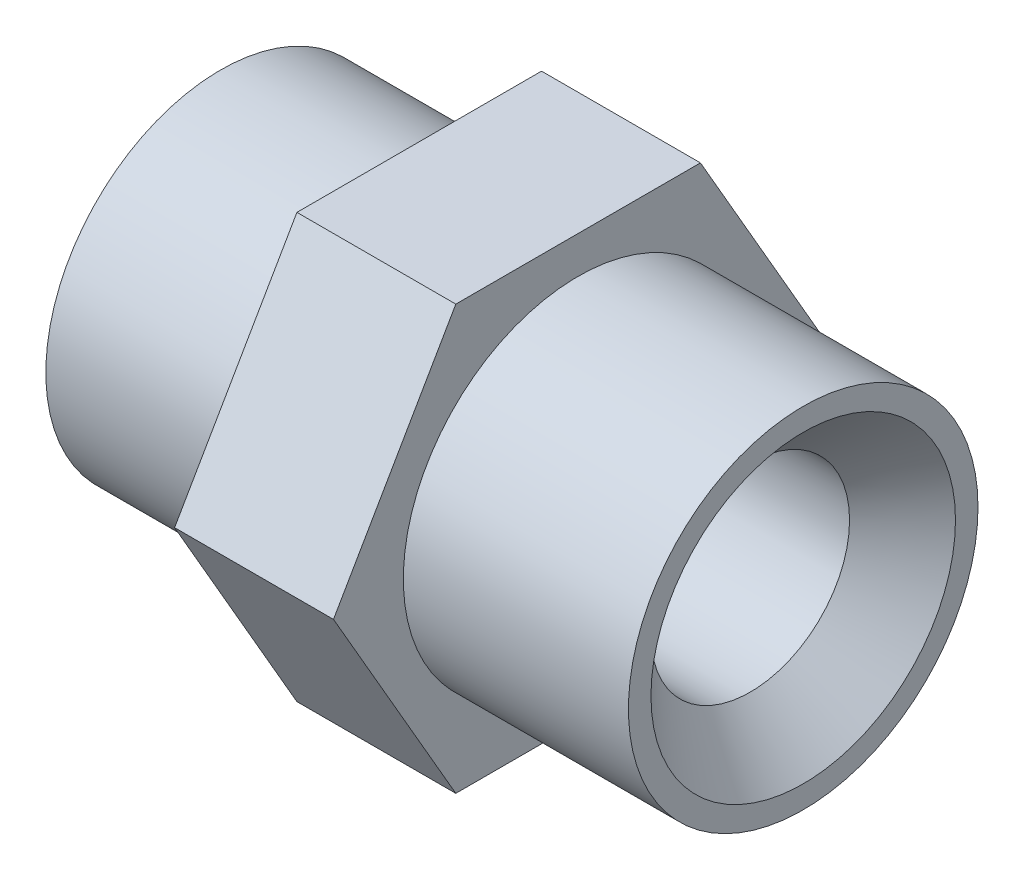
ISO-10303-21;
HEADER;
FILE_DESCRIPTION(('STEP AP214'),'2;1');
FILE_NAME('part.step','',(''),(''),'','','');
FILE_SCHEMA(('AUTOMOTIVE_DESIGN { 1 0 10303 214 1 1 1 1 }'));
ENDSEC;
DATA;
#1=APPLICATION_CONTEXT('core data for automotive mechanical design processes');
#2=APPLICATION_PROTOCOL_DEFINITION('international standard','automotive_design',2000,#1);
#3=PRODUCT_CONTEXT('',#1,'mechanical');
#4=PRODUCT('Part','Part','',(#3));
#5=PRODUCT_RELATED_PRODUCT_CATEGORY('part','',(#4));
#6=PRODUCT_DEFINITION_FORMATION('','',#4);
#7=PRODUCT_DEFINITION_CONTEXT('part definition',#1,'design');
#8=PRODUCT_DEFINITION('design','',#6,#7);
#9=PRODUCT_DEFINITION_SHAPE('','',#8);
#10=(LENGTH_UNIT() NAMED_UNIT(*) SI_UNIT(.MILLI.,.METRE.));
#11=(NAMED_UNIT(*) PLANE_ANGLE_UNIT() SI_UNIT($,.RADIAN.));
#12=(NAMED_UNIT(*) SI_UNIT($,.STERADIAN.) SOLID_ANGLE_UNIT());
#13=UNCERTAINTY_MEASURE_WITH_UNIT(LENGTH_MEASURE(1.E-05),#10,'distance_accuracy_value','');
#14=(GEOMETRIC_REPRESENTATION_CONTEXT(3) GLOBAL_UNCERTAINTY_ASSIGNED_CONTEXT((#13)) GLOBAL_UNIT_ASSIGNED_CONTEXT((#10,
#11,#12)) REPRESENTATION_CONTEXT('',''));
#15=CARTESIAN_POINT('',(0.,0.,0.));
#16=DIRECTION('',(0.,0.,1.));
#17=DIRECTION('',(1.,0.,0.));
#18=AXIS2_PLACEMENT_3D('',#15,#16,#17);
#19=CARTESIAN_POINT('',(44.,0.,0.));
#20=DIRECTION('',(1.,0.,0.));
#21=DIRECTION('',(0.,0.,-1.));
#22=AXIS2_PLACEMENT_3D('',#19,#20,#21);
#23=PLANE('',#22);
#24=CARTESIAN_POINT('',(44.,0.,0.));
#25=DIRECTION('',(1.,0.,0.));
#26=DIRECTION('',(0.,0.,-1.));
#27=AXIS2_PLACEMENT_3D('',#24,#25,#26);
#28=CIRCLE('',#27,11.5);
#29=CARTESIAN_POINT('',(44.,0.,-11.5));
#30=VERTEX_POINT('',#29);
#31=EDGE_CURVE('E187',#30,#30,#28,.F.);
#32=ORIENTED_EDGE('',*,*,#31,.T.);
#33=EDGE_LOOP('',(#32));
#34=FACE_BOUND('',#33,.T.);
#35=CARTESIAN_POINT('',(44.,0.,0.));
#36=DIRECTION('',(1.,0.,0.));
#37=DIRECTION('',(0.,0.,-1.));
#38=AXIS2_PLACEMENT_3D('',#35,#36,#37);
#39=CIRCLE('',#38,13.2);
#40=CARTESIAN_POINT('',(44.,0.,-13.2));
#41=VERTEX_POINT('',#40);
#42=EDGE_CURVE('E173',#41,#41,#39,.T.);
#43=ORIENTED_EDGE('',*,*,#42,.T.);
#44=EDGE_LOOP('',(#43));
#45=FACE_BOUND('',#44,.T.);
#46=ADVANCED_FACE('F45',(#34,#45),#23,.T.);
#47=CARTESIAN_POINT('',(44.,0.,0.));
#48=DIRECTION('',(-1.,0.,0.));
#49=DIRECTION('',(0.,0.,1.));
#50=AXIS2_PLACEMENT_3D('',#47,#48,#49);
#51=CYLINDRICAL_SURFACE('',#50,13.2);
#52=CARTESIAN_POINT('',(27.,0.,0.));
#53=DIRECTION('',(1.,0.,0.));
#54=DIRECTION('',(0.,0.,-1.));
#55=AXIS2_PLACEMENT_3D('',#52,#53,#54);
#56=CIRCLE('',#55,13.2);
#57=CARTESIAN_POINT('',(27.,0.,-13.2));
#58=VERTEX_POINT('',#57);
#59=EDGE_CURVE('E167',#58,#58,#56,.T.);
#60=ORIENTED_EDGE('',*,*,#59,.T.);
#61=EDGE_LOOP('',(#60));
#62=FACE_BOUND('',#61,.T.);
#63=ORIENTED_EDGE('',*,*,#42,.F.);
#64=EDGE_LOOP('',(#63));
#65=FACE_BOUND('',#64,.T.);
#66=ADVANCED_FACE('F206',(#62,#65),#51,.T.);
#67=CARTESIAN_POINT('',(44.,0.,0.));
#68=DIRECTION('',(-1.,0.,0.));
#69=DIRECTION('',(0.,0.,1.));
#70=AXIS2_PLACEMENT_3D('',#67,#68,#69);
#71=CYLINDRICAL_SURFACE('',#70,7.5);
#72=CARTESIAN_POINT('',(4.00000000000002,0.,0.));
#73=DIRECTION('',(1.,0.,0.));
#74=DIRECTION('',(0.,0.,-1.));
#75=AXIS2_PLACEMENT_3D('',#72,#73,#74);
#76=CIRCLE('',#75,7.5);
#77=CARTESIAN_POINT('',(4.00000000000002,0.,-7.5));
#78=VERTEX_POINT('',#77);
#79=EDGE_CURVE('E11',#78,#78,#76,.F.);
#80=ORIENTED_EDGE('',*,*,#79,.T.);
#81=EDGE_LOOP('',(#80));
#82=FACE_BOUND('',#81,.T.);
#83=CARTESIAN_POINT('',(40.,0.,0.));
#84=DIRECTION('',(1.,0.,0.));
#85=DIRECTION('',(0.,0.,-1.));
#86=AXIS2_PLACEMENT_3D('',#83,#84,#85);
#87=CIRCLE('',#86,7.5);
#88=CARTESIAN_POINT('',(40.,0.,-7.5));
#89=VERTEX_POINT('',#88);
#90=EDGE_CURVE('E172',#89,#89,#87,.T.);
#91=ORIENTED_EDGE('',*,*,#90,.T.);
#92=EDGE_LOOP('',(#91));
#93=FACE_BOUND('',#92,.T.);
#94=ADVANCED_FACE('F212',(#82,#93),#71,.F.);
#95=CARTESIAN_POINT('',(27.,-16.,-9.23760430703402));
#96=DIRECTION('',(0.,0.5,0.866025403784439));
#97=DIRECTION('',(0.,-0.866025403784439,0.5));
#98=AXIS2_PLACEMENT_3D('',#95,#96,#97);
#99=PLANE('',#98);
#100=DIRECTION('',(0.,0.866025403784439,-0.5));
#101=VECTOR('',#100,1.);
#102=CARTESIAN_POINT('',(15.,-16.,-9.23760430703402));
#103=LINE('',#102,#101);
#104=CARTESIAN_POINT('',(15.,-16.,-9.23760430703402));
#105=VERTEX_POINT('',#104);
#106=CARTESIAN_POINT('',(15.,0.,-18.475208614068));
#107=VERTEX_POINT('',#106);
#108=EDGE_CURVE('E137',#105,#107,#103,.T.);
#109=ORIENTED_EDGE('',*,*,#108,.T.);
#110=DIRECTION('',(-1.,0.,0.));
#111=VECTOR('',#110,1.);
#112=CARTESIAN_POINT('',(27.,0.,-18.475208614068));
#113=LINE('',#112,#111);
#114=CARTESIAN_POINT('',(27.,0.,-18.475208614068));
#115=VERTEX_POINT('',#114);
#116=EDGE_CURVE('E164',#115,#107,#113,.T.);
#117=ORIENTED_EDGE('',*,*,#116,.F.);
#118=DIRECTION('',(0.,0.866025403784439,-0.5));
#119=VECTOR('',#118,1.);
#120=CARTESIAN_POINT('',(27.,-16.,-9.23760430703402));
#121=LINE('',#120,#119);
#122=CARTESIAN_POINT('',(27.,-16.,-9.23760430703402));
#123=VERTEX_POINT('',#122);
#124=EDGE_CURVE('E153',#123,#115,#121,.T.);
#125=ORIENTED_EDGE('',*,*,#124,.F.);
#126=DIRECTION('',(-1.,0.,0.));
#127=VECTOR('',#126,1.);
#128=CARTESIAN_POINT('',(27.,-16.,-9.23760430703402));
#129=LINE('',#128,#127);
#130=EDGE_CURVE('E133',#123,#105,#129,.T.);
#131=ORIENTED_EDGE('',*,*,#130,.T.);
#132=EDGE_LOOP('',(#109,#117,#125,#131));
#133=FACE_BOUND('',#132,.T.);
#134=ADVANCED_FACE('F244',(#133),#99,.F.);
#135=CARTESIAN_POINT('',(27.,0.,-18.475208614068));
#136=DIRECTION('',(0.,-0.5,0.866025403784439));
#137=DIRECTION('',(0.,-0.866025403784439,-0.5));
#138=AXIS2_PLACEMENT_3D('',#135,#136,#137);
#139=PLANE('',#138);
#140=DIRECTION('',(0.,0.866025403784439,0.5));
#141=VECTOR('',#140,1.);
#142=CARTESIAN_POINT('',(15.,0.,-18.475208614068));
#143=LINE('',#142,#141);
#144=CARTESIAN_POINT('',(15.,16.,-9.23760430703401));
#145=VERTEX_POINT('',#144);
#146=EDGE_CURVE('E141',#107,#145,#143,.T.);
#147=ORIENTED_EDGE('',*,*,#146,.T.);
#148=DIRECTION('',(-1.,0.,0.));
#149=VECTOR('',#148,1.);
#150=CARTESIAN_POINT('',(27.,16.,-9.23760430703401));
#151=LINE('',#150,#149);
#152=CARTESIAN_POINT('',(27.,16.,-9.23760430703401));
#153=VERTEX_POINT('',#152);
#154=EDGE_CURVE('E160',#153,#145,#151,.T.);
#155=ORIENTED_EDGE('',*,*,#154,.F.);
#156=DIRECTION('',(0.,0.866025403784439,0.5));
#157=VECTOR('',#156,1.);
#158=CARTESIAN_POINT('',(27.,0.,-18.475208614068));
#159=LINE('',#158,#157);
#160=EDGE_CURVE('E102',#115,#153,#159,.T.);
#161=ORIENTED_EDGE('',*,*,#160,.F.);
#162=ORIENTED_EDGE('',*,*,#116,.T.);
#163=EDGE_LOOP('',(#147,#155,#161,#162));
#164=FACE_BOUND('',#163,.T.);
#165=ADVANCED_FACE('F262',(#164),#139,.F.);
#166=CARTESIAN_POINT('',(27.,16.,-9.23760430703401));
#167=DIRECTION('',(0.,-1.,0.));
#168=DIRECTION('',(0.,0.,-1.));
#169=AXIS2_PLACEMENT_3D('',#166,#167,#168);
#170=PLANE('',#169);
#171=DIRECTION('',(0.,0.,1.));
#172=VECTOR('',#171,1.);
#173=CARTESIAN_POINT('',(15.,16.,-9.23760430703401));
#174=LINE('',#173,#172);
#175=CARTESIAN_POINT('',(15.,16.,9.23760430703403));
#176=VERTEX_POINT('',#175);
#177=EDGE_CURVE('E144',#145,#176,#174,.T.);
#178=ORIENTED_EDGE('',*,*,#177,.T.);
#179=DIRECTION('',(-1.,0.,0.));
#180=VECTOR('',#179,1.);
#181=CARTESIAN_POINT('',(27.,16.,9.23760430703403));
#182=LINE('',#181,#180);
#183=CARTESIAN_POINT('',(27.,16.,9.23760430703403));
#184=VERTEX_POINT('',#183);
#185=EDGE_CURVE('E126',#184,#176,#182,.T.);
#186=ORIENTED_EDGE('',*,*,#185,.F.);
#187=DIRECTION('',(0.,0.,1.));
#188=VECTOR('',#187,1.);
#189=CARTESIAN_POINT('',(27.,16.,-9.23760430703401));
#190=LINE('',#189,#188);
#191=EDGE_CURVE('E115',#153,#184,#190,.T.);
#192=ORIENTED_EDGE('',*,*,#191,.F.);
#193=ORIENTED_EDGE('',*,*,#154,.T.);
#194=EDGE_LOOP('',(#178,#186,#192,#193));
#195=FACE_BOUND('',#194,.T.);
#196=ADVANCED_FACE('F259',(#195),#170,.F.);
#197=CARTESIAN_POINT('',(27.,16.,9.23760430703403));
#198=DIRECTION('',(0.,-0.5,-0.866025403784439));
#199=DIRECTION('',(0.,0.866025403784439,-0.5));
#200=AXIS2_PLACEMENT_3D('',#197,#198,#199);
#201=PLANE('',#200);
#202=DIRECTION('',(0.,-0.866025403784439,0.5));
#203=VECTOR('',#202,1.);
#204=CARTESIAN_POINT('',(15.,16.,9.23760430703403));
#205=LINE('',#204,#203);
#206=CARTESIAN_POINT('',(15.,0.,18.475208614068));
#207=VERTEX_POINT('',#206);
#208=EDGE_CURVE('E124',#176,#207,#205,.T.);
#209=ORIENTED_EDGE('',*,*,#208,.T.);
#210=DIRECTION('',(-1.,0.,0.));
#211=VECTOR('',#210,1.);
#212=CARTESIAN_POINT('',(27.,0.,18.475208614068));
#213=LINE('',#212,#211);
#214=CARTESIAN_POINT('',(27.,0.,18.475208614068));
#215=VERTEX_POINT('',#214);
#216=EDGE_CURVE('E121',#215,#207,#213,.T.);
#217=ORIENTED_EDGE('',*,*,#216,.F.);
#218=DIRECTION('',(0.,-0.866025403784439,0.5));
#219=VECTOR('',#218,1.);
#220=CARTESIAN_POINT('',(27.,16.,9.23760430703403));
#221=LINE('',#220,#219);
#222=EDGE_CURVE('E109',#184,#215,#221,.T.);
#223=ORIENTED_EDGE('',*,*,#222,.F.);
#224=ORIENTED_EDGE('',*,*,#185,.T.);
#225=EDGE_LOOP('',(#209,#217,#223,#224));
#226=FACE_BOUND('',#225,.T.);
#227=ADVANCED_FACE('F122',(#226),#201,.F.);
#228=CARTESIAN_POINT('',(27.,0.,18.475208614068));
#229=DIRECTION('',(0.,0.5,-0.866025403784439));
#230=DIRECTION('',(0.,0.866025403784439,0.5));
#231=AXIS2_PLACEMENT_3D('',#228,#229,#230);
#232=PLANE('',#231);
#233=DIRECTION('',(0.,-0.866025403784439,-0.5));
#234=VECTOR('',#233,1.);
#235=CARTESIAN_POINT('',(15.,0.,18.475208614068));
#236=LINE('',#235,#234);
#237=CARTESIAN_POINT('',(15.,-16.,9.23760430703402));
#238=VERTEX_POINT('',#237);
#239=EDGE_CURVE('E87',#207,#238,#236,.T.);
#240=ORIENTED_EDGE('',*,*,#239,.T.);
#241=DIRECTION('',(-1.,0.,0.));
#242=VECTOR('',#241,1.);
#243=CARTESIAN_POINT('',(27.,-16.,9.23760430703402));
#244=LINE('',#243,#242);
#245=CARTESIAN_POINT('',(27.,-16.,9.23760430703402));
#246=VERTEX_POINT('',#245);
#247=EDGE_CURVE('E127',#246,#238,#244,.T.);
#248=ORIENTED_EDGE('',*,*,#247,.F.);
#249=DIRECTION('',(0.,-0.866025403784439,-0.5));
#250=VECTOR('',#249,1.);
#251=CARTESIAN_POINT('',(27.,0.,18.475208614068));
#252=LINE('',#251,#250);
#253=EDGE_CURVE('E113',#215,#246,#252,.T.);
#254=ORIENTED_EDGE('',*,*,#253,.F.);
#255=ORIENTED_EDGE('',*,*,#216,.T.);
#256=EDGE_LOOP('',(#240,#248,#254,#255));
#257=FACE_BOUND('',#256,.T.);
#258=ADVANCED_FACE('F129',(#257),#232,.F.);
#259=CARTESIAN_POINT('',(27.,-16.,9.23760430703402));
#260=DIRECTION('',(0.,1.,0.));
#261=DIRECTION('',(0.,0.,1.));
#262=AXIS2_PLACEMENT_3D('',#259,#260,#261);
#263=PLANE('',#262);
#264=DIRECTION('',(0.,0.,-1.));
#265=VECTOR('',#264,1.);
#266=CARTESIAN_POINT('',(15.,-16.,9.23760430703402));
#267=LINE('',#266,#265);
#268=EDGE_CURVE('E93',#238,#105,#267,.T.);
#269=ORIENTED_EDGE('',*,*,#268,.T.);
#270=ORIENTED_EDGE('',*,*,#130,.F.);
#271=DIRECTION('',(0.,0.,-1.));
#272=VECTOR('',#271,1.);
#273=CARTESIAN_POINT('',(27.,-16.,9.23760430703402));
#274=LINE('',#273,#272);
#275=EDGE_CURVE('E64',#246,#123,#274,.T.);
#276=ORIENTED_EDGE('',*,*,#275,.F.);
#277=ORIENTED_EDGE('',*,*,#247,.T.);
#278=EDGE_LOOP('',(#269,#270,#276,#277));
#279=FACE_BOUND('',#278,.T.);
#280=ADVANCED_FACE('F246',(#279),#263,.F.);
#281=CARTESIAN_POINT('',(27.,0.,0.));
#282=DIRECTION('',(1.,0.,0.));
#283=DIRECTION('',(0.,0.,-1.));
#284=AXIS2_PLACEMENT_3D('',#281,#282,#283);
#285=PLANE('',#284);
#286=ORIENTED_EDGE('',*,*,#59,.F.);
#287=EDGE_LOOP('',(#286));
#288=FACE_BOUND('',#287,.T.);
#289=ORIENTED_EDGE('',*,*,#124,.T.);
#290=ORIENTED_EDGE('',*,*,#160,.T.);
#291=ORIENTED_EDGE('',*,*,#191,.T.);
#292=ORIENTED_EDGE('',*,*,#222,.T.);
#293=ORIENTED_EDGE('',*,*,#253,.T.);
#294=ORIENTED_EDGE('',*,*,#275,.T.);
#295=EDGE_LOOP('',(#289,#290,#291,#292,#293,#294));
#296=FACE_BOUND('',#295,.T.);
#297=ADVANCED_FACE('F111',(#288,#296),#285,.T.);
#298=CARTESIAN_POINT('',(15.,0.,0.));
#299=DIRECTION('',(1.,0.,0.));
#300=DIRECTION('',(0.,0.,-1.));
#301=AXIS2_PLACEMENT_3D('',#298,#299,#300);
#302=PLANE('',#301);
#303=CARTESIAN_POINT('',(15.,0.,0.));
#304=DIRECTION('',(1.,0.,0.));
#305=DIRECTION('',(0.,0.,-1.));
#306=AXIS2_PLACEMENT_3D('',#303,#304,#305);
#307=CIRCLE('',#306,13.2);
#308=CARTESIAN_POINT('',(15.,0.,-13.2));
#309=VERTEX_POINT('',#308);
#310=EDGE_CURVE('E168',#309,#309,#307,.T.);
#311=ORIENTED_EDGE('',*,*,#310,.T.);
#312=EDGE_LOOP('',(#311));
#313=FACE_BOUND('',#312,.T.);
#314=ORIENTED_EDGE('',*,*,#108,.F.);
#315=ORIENTED_EDGE('',*,*,#268,.F.);
#316=ORIENTED_EDGE('',*,*,#239,.F.);
#317=ORIENTED_EDGE('',*,*,#208,.F.);
#318=ORIENTED_EDGE('',*,*,#177,.F.);
#319=ORIENTED_EDGE('',*,*,#146,.F.);
#320=EDGE_LOOP('',(#314,#315,#316,#317,#318,#319));
#321=FACE_BOUND('',#320,.T.);
#322=ADVANCED_FACE('F229',(#313,#321),#302,.F.);
#323=CARTESIAN_POINT('',(0.,0.,0.));
#324=DIRECTION('',(1.,0.,0.));
#325=DIRECTION('',(0.,0.,-1.));
#326=AXIS2_PLACEMENT_3D('',#323,#324,#325);
#327=CIRCLE('',#326,13.2);
#328=CARTESIAN_POINT('',(0.,0.,-13.2));
#329=VERTEX_POINT('',#328);
#330=EDGE_CURVE('E177',#329,#329,#327,.T.);
#331=ORIENTED_EDGE('',*,*,#330,.T.);
#332=EDGE_LOOP('',(#331));
#333=FACE_BOUND('',#332,.T.);
#334=ORIENTED_EDGE('',*,*,#310,.F.);
#335=EDGE_LOOP('',(#334));
#336=FACE_BOUND('',#335,.T.);
#337=ADVANCED_FACE('F215',(#333,#336),#51,.T.);
#338=CARTESIAN_POINT('',(0.,0.,0.));
#339=DIRECTION('',(1.,0.,0.));
#340=DIRECTION('',(0.,0.,-1.));
#341=AXIS2_PLACEMENT_3D('',#338,#339,#340);
#342=PLANE('',#341);
#343=CARTESIAN_POINT('',(0.,0.,0.));
#344=DIRECTION('',(1.,0.,0.));
#345=DIRECTION('',(0.,0.,-1.));
#346=AXIS2_PLACEMENT_3D('',#343,#344,#345);
#347=CIRCLE('',#346,11.5);
#348=CARTESIAN_POINT('',(0.,0.,-11.5));
#349=VERTEX_POINT('',#348);
#350=EDGE_CURVE('E56',#349,#349,#347,.T.);
#351=ORIENTED_EDGE('',*,*,#350,.T.);
#352=EDGE_LOOP('',(#351));
#353=FACE_BOUND('',#352,.T.);
#354=ORIENTED_EDGE('',*,*,#330,.F.);
#355=EDGE_LOOP('',(#354));
#356=FACE_BOUND('',#355,.T.);
#357=ADVANCED_FACE('F194',(#353,#356),#342,.F.);
#358=CARTESIAN_POINT('',(40.,0.,0.));
#359=DIRECTION('',(1.,0.,0.));
#360=DIRECTION('',(0.,0.,-1.));
#361=AXIS2_PLACEMENT_3D('',#358,#359,#360);
#362=CONICAL_SURFACE('',#361,7.5,0.785398163397449);
#363=ORIENTED_EDGE('',*,*,#31,.F.);
#364=EDGE_LOOP('',(#363));
#365=FACE_BOUND('',#364,.T.);
#366=ORIENTED_EDGE('',*,*,#90,.F.);
#367=EDGE_LOOP('',(#366));
#368=FACE_BOUND('',#367,.T.);
#369=ADVANCED_FACE('F198',(#365,#368),#362,.F.);
#370=CARTESIAN_POINT('',(0.,0.,0.));
#371=DIRECTION('',(-1.,0.,0.));
#372=DIRECTION('',(0.,0.,1.));
#373=AXIS2_PLACEMENT_3D('',#370,#371,#372);
#374=CONICAL_SURFACE('',#373,11.5,0.785398163397446);
#375=ORIENTED_EDGE('',*,*,#79,.F.);
#376=EDGE_LOOP('',(#375));
#377=FACE_BOUND('',#376,.T.);
#378=ORIENTED_EDGE('',*,*,#350,.F.);
#379=EDGE_LOOP('',(#378));
#380=FACE_BOUND('',#379,.T.);
#381=ADVANCED_FACE('F48',(#377,#380),#374,.F.);
#382=CLOSED_SHELL('',(#46,#66,#94,#134,#165,#196,#227,#258,#280,#297,#322,#337,#357,#369,#381));
#383=MANIFOLD_SOLID_BREP('B2',#382);
#384=ADVANCED_BREP_SHAPE_REPRESENTATION('',(#18,#383),#14);
#385=SHAPE_DEFINITION_REPRESENTATION(#9,#384);
ENDSEC;
END-ISO-10303-21;
